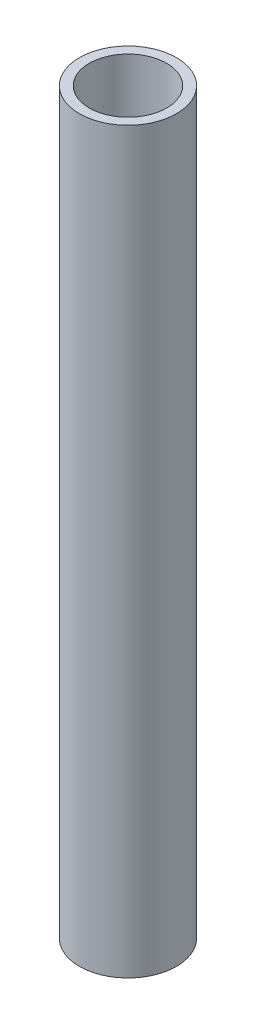
ISO-10303-21;
HEADER;
FILE_DESCRIPTION(('STEP AP214'),'2;1');
FILE_NAME('part.step','',(''),(''),'','','');
FILE_SCHEMA(('AUTOMOTIVE_DESIGN { 1 0 10303 214 1 1 1 1 }'));
ENDSEC;
DATA;
#1=APPLICATION_CONTEXT('core data for automotive mechanical design processes');
#2=APPLICATION_PROTOCOL_DEFINITION('international standard','automotive_design',2000,#1);
#3=PRODUCT_CONTEXT('',#1,'mechanical');
#4=PRODUCT('Part','Part','',(#3));
#5=PRODUCT_RELATED_PRODUCT_CATEGORY('part','',(#4));
#6=PRODUCT_DEFINITION_FORMATION('','',#4);
#7=PRODUCT_DEFINITION_CONTEXT('part definition',#1,'design');
#8=PRODUCT_DEFINITION('design','',#6,#7);
#9=PRODUCT_DEFINITION_SHAPE('','',#8);
#10=(LENGTH_UNIT() NAMED_UNIT(*) SI_UNIT(.MILLI.,.METRE.));
#11=(NAMED_UNIT(*) PLANE_ANGLE_UNIT() SI_UNIT($,.RADIAN.));
#12=(NAMED_UNIT(*) SI_UNIT($,.STERADIAN.) SOLID_ANGLE_UNIT());
#13=UNCERTAINTY_MEASURE_WITH_UNIT(LENGTH_MEASURE(1.E-05),#10,'distance_accuracy_value','');
#14=(GEOMETRIC_REPRESENTATION_CONTEXT(3) GLOBAL_UNCERTAINTY_ASSIGNED_CONTEXT((#13)) GLOBAL_UNIT_ASSIGNED_CONTEXT((#10,
#11,#12)) REPRESENTATION_CONTEXT('',''));
#15=CARTESIAN_POINT('',(0.,0.,0.));
#16=DIRECTION('',(0.,0.,1.));
#17=DIRECTION('',(1.,0.,0.));
#18=AXIS2_PLACEMENT_3D('',#15,#16,#17);
#19=CARTESIAN_POINT('',(0.,254.,0.));
#20=DIRECTION('',(0.,1.,0.));
#21=DIRECTION('',(0.,0.,1.));
#22=AXIS2_PLACEMENT_3D('',#19,#20,#21);
#23=PLANE('',#22);
#24=CARTESIAN_POINT('',(0.,254.,0.));
#25=DIRECTION('',(0.,1.,0.));
#26=DIRECTION('',(0.,0.,1.));
#27=AXIS2_PLACEMENT_3D('',#24,#25,#26);
#28=CIRCLE('',#27,16.7005);
#29=CARTESIAN_POINT('',(0.,254.,16.7005));
#30=VERTEX_POINT('',#29);
#31=EDGE_CURVE('E10',#30,#30,#28,.T.);
#32=ORIENTED_EDGE('',*,*,#31,.T.);
#33=EDGE_LOOP('',(#32));
#34=FACE_BOUND('',#33,.T.);
#35=CARTESIAN_POINT('',(0.,254.,0.));
#36=DIRECTION('',(0.,1.,0.));
#37=DIRECTION('',(0.,0.,1.));
#38=AXIS2_PLACEMENT_3D('',#35,#36,#37);
#39=CIRCLE('',#38,13.3223);
#40=CARTESIAN_POINT('',(0.,254.,13.3223));
#41=VERTEX_POINT('',#40);
#42=EDGE_CURVE('E41',#41,#41,#39,.T.);
#43=ORIENTED_EDGE('',*,*,#42,.F.);
#44=EDGE_LOOP('',(#43));
#45=FACE_BOUND('',#44,.T.);
#46=ADVANCED_FACE('F30',(#34,#45),#23,.T.);
#47=CARTESIAN_POINT('',(0.,0.,0.));
#48=DIRECTION('',(0.,1.,0.));
#49=DIRECTION('',(0.,0.,1.));
#50=AXIS2_PLACEMENT_3D('',#47,#48,#49);
#51=PLANE('',#50);
#52=CARTESIAN_POINT('',(0.,0.,0.));
#53=DIRECTION('',(0.,1.,0.));
#54=DIRECTION('',(0.,0.,1.));
#55=AXIS2_PLACEMENT_3D('',#52,#53,#54);
#56=CIRCLE('',#55,16.7005);
#57=CARTESIAN_POINT('',(0.,0.,16.7005));
#58=VERTEX_POINT('',#57);
#59=EDGE_CURVE('E34',#58,#58,#56,.T.);
#60=ORIENTED_EDGE('',*,*,#59,.F.);
#61=EDGE_LOOP('',(#60));
#62=FACE_BOUND('',#61,.T.);
#63=CARTESIAN_POINT('',(0.,0.,0.));
#64=DIRECTION('',(0.,1.,0.));
#65=DIRECTION('',(0.,0.,1.));
#66=AXIS2_PLACEMENT_3D('',#63,#64,#65);
#67=CIRCLE('',#66,13.3223);
#68=CARTESIAN_POINT('',(0.,0.,13.3223));
#69=VERTEX_POINT('',#68);
#70=EDGE_CURVE('E43',#69,#69,#67,.T.);
#71=ORIENTED_EDGE('',*,*,#70,.T.);
#72=EDGE_LOOP('',(#71));
#73=FACE_BOUND('',#72,.T.);
#74=ADVANCED_FACE('F53',(#62,#73),#51,.F.);
#75=CARTESIAN_POINT('',(0.,254.,0.));
#76=DIRECTION('',(0.,-1.,0.));
#77=DIRECTION('',(0.,0.,-1.));
#78=AXIS2_PLACEMENT_3D('',#75,#76,#77);
#79=CYLINDRICAL_SURFACE('',#78,16.7005);
#80=ORIENTED_EDGE('',*,*,#31,.F.);
#81=EDGE_LOOP('',(#80));
#82=FACE_BOUND('',#81,.T.);
#83=ORIENTED_EDGE('',*,*,#59,.T.);
#84=EDGE_LOOP('',(#83));
#85=FACE_BOUND('',#84,.T.);
#86=ADVANCED_FACE('F32',(#82,#85),#79,.T.);
#87=CARTESIAN_POINT('',(0.,254.,0.));
#88=DIRECTION('',(0.,-1.,0.));
#89=DIRECTION('',(0.,0.,-1.));
#90=AXIS2_PLACEMENT_3D('',#87,#88,#89);
#91=CYLINDRICAL_SURFACE('',#90,13.3223);
#92=ORIENTED_EDGE('',*,*,#42,.T.);
#93=EDGE_LOOP('',(#92));
#94=FACE_BOUND('',#93,.T.);
#95=ORIENTED_EDGE('',*,*,#70,.F.);
#96=EDGE_LOOP('',(#95));
#97=FACE_BOUND('',#96,.T.);
#98=ADVANCED_FACE('F49',(#94,#97),#91,.F.);
#99=CLOSED_SHELL('',(#46,#74,#86,#98));
#100=MANIFOLD_SOLID_BREP('B2',#99);
#101=ADVANCED_BREP_SHAPE_REPRESENTATION('',(#18,#100),#14);
#102=SHAPE_DEFINITION_REPRESENTATION(#9,#101);
ENDSEC;
END-ISO-10303-21;
